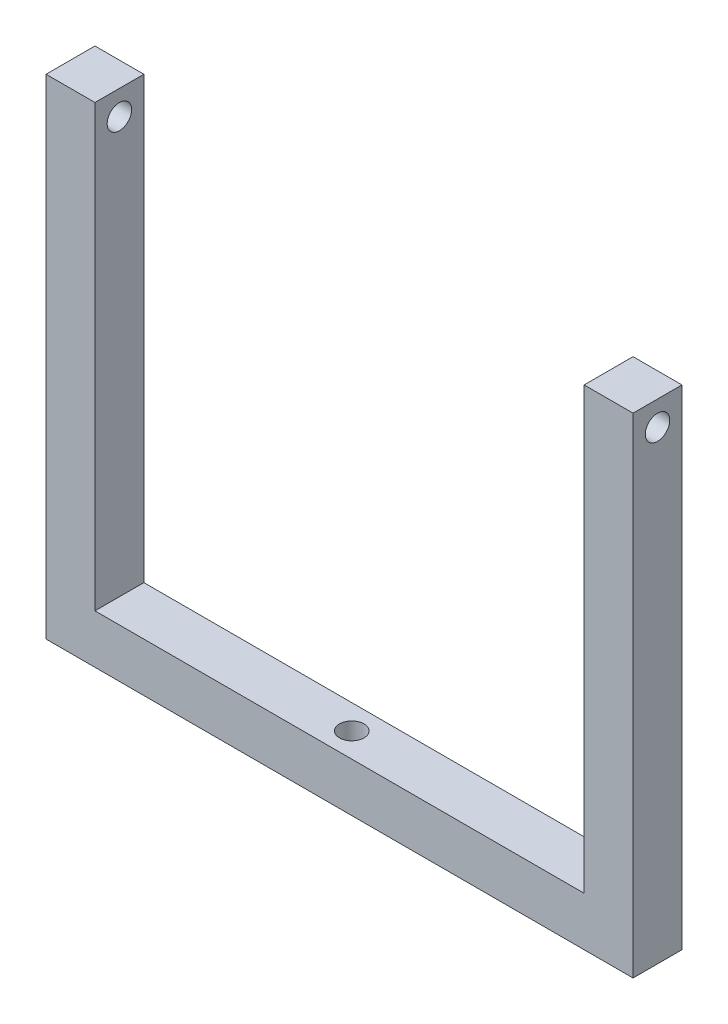
ISO-10303-21;
HEADER;
FILE_DESCRIPTION(('STEP AP214'),'2;1');
FILE_NAME('part.step','',(''),(''),'','','');
FILE_SCHEMA(('AUTOMOTIVE_DESIGN { 1 0 10303 214 1 1 1 1 }'));
ENDSEC;
DATA;
#1=APPLICATION_CONTEXT('core data for automotive mechanical design processes');
#2=APPLICATION_PROTOCOL_DEFINITION('international standard','automotive_design',2000,#1);
#3=PRODUCT_CONTEXT('',#1,'mechanical');
#4=PRODUCT('Part','Part','',(#3));
#5=PRODUCT_RELATED_PRODUCT_CATEGORY('part','',(#4));
#6=PRODUCT_DEFINITION_FORMATION('','',#4);
#7=PRODUCT_DEFINITION_CONTEXT('part definition',#1,'design');
#8=PRODUCT_DEFINITION('design','',#6,#7);
#9=PRODUCT_DEFINITION_SHAPE('','',#8);
#10=(LENGTH_UNIT() NAMED_UNIT(*) SI_UNIT(.MILLI.,.METRE.));
#11=(NAMED_UNIT(*) PLANE_ANGLE_UNIT() SI_UNIT($,.RADIAN.));
#12=(NAMED_UNIT(*) SI_UNIT($,.STERADIAN.) SOLID_ANGLE_UNIT());
#13=UNCERTAINTY_MEASURE_WITH_UNIT(LENGTH_MEASURE(1.E-05),#10,'distance_accuracy_value','');
#14=(GEOMETRIC_REPRESENTATION_CONTEXT(3) GLOBAL_UNCERTAINTY_ASSIGNED_CONTEXT((#13)) GLOBAL_UNIT_ASSIGNED_CONTEXT((#10,
#11,#12)) REPRESENTATION_CONTEXT('',''));
#15=CARTESIAN_POINT('',(0.,0.,0.));
#16=DIRECTION('',(0.,0.,1.));
#17=DIRECTION('',(1.,0.,0.));
#18=AXIS2_PLACEMENT_3D('',#15,#16,#17);
#19=CARTESIAN_POINT('',(0.,0.,12.7));
#20=DIRECTION('',(0.,-1.,0.));
#21=DIRECTION('',(1.,0.,0.));
#22=AXIS2_PLACEMENT_3D('',#19,#20,#21);
#23=PLANE('',#22);
#24=DIRECTION('',(-1.,0.,0.));
#25=VECTOR('',#24,1.);
#26=CARTESIAN_POINT('',(0.,0.,0.));
#27=LINE('',#26,#25);
#28=CARTESIAN_POINT('',(0.,0.,0.));
#29=VERTEX_POINT('',#28);
#30=CARTESIAN_POINT('',(-12.7,0.,0.));
#31=VERTEX_POINT('',#30);
#32=EDGE_CURVE('E141',#29,#31,#27,.T.);
#33=ORIENTED_EDGE('',*,*,#32,.T.);
#34=DIRECTION('',(0.,0.,-1.));
#35=VECTOR('',#34,1.);
#36=CARTESIAN_POINT('',(-12.7,0.,12.7));
#37=LINE('',#36,#35);
#38=CARTESIAN_POINT('',(-12.7,0.,12.7));
#39=VERTEX_POINT('',#38);
#40=EDGE_CURVE('E11',#39,#31,#37,.T.);
#41=ORIENTED_EDGE('',*,*,#40,.F.);
#42=DIRECTION('',(-1.,0.,0.));
#43=VECTOR('',#42,1.);
#44=CARTESIAN_POINT('',(0.,0.,12.7));
#45=LINE('',#44,#43);
#46=CARTESIAN_POINT('',(0.,0.,12.7));
#47=VERTEX_POINT('',#46);
#48=EDGE_CURVE('E164',#47,#39,#45,.T.);
#49=ORIENTED_EDGE('',*,*,#48,.F.);
#50=DIRECTION('',(0.,0.,-1.));
#51=VECTOR('',#50,1.);
#52=CARTESIAN_POINT('',(0.,0.,12.7));
#53=LINE('',#52,#51);
#54=EDGE_CURVE('E137',#47,#29,#53,.T.);
#55=ORIENTED_EDGE('',*,*,#54,.T.);
#56=EDGE_LOOP('',(#33,#41,#49,#55));
#57=FACE_BOUND('',#56,.T.);
#58=ADVANCED_FACE('F39',(#57),#23,.F.);
#59=CARTESIAN_POINT('',(-12.7,0.,12.7));
#60=DIRECTION('',(1.,0.,0.));
#61=DIRECTION('',(0.,1.,0.));
#62=AXIS2_PLACEMENT_3D('',#59,#60,#61);
#63=PLANE('',#62);
#64=CARTESIAN_POINT('',(-12.7,-6.35,6.35));
#65=DIRECTION('',(-1.,0.,0.));
#66=DIRECTION('',(0.,-1.,0.));
#67=AXIS2_PLACEMENT_3D('',#64,#65,#66);
#68=CIRCLE('',#67,3.175);
#69=CARTESIAN_POINT('',(-12.7,-9.525,6.35));
#70=VERTEX_POINT('',#69);
#71=EDGE_CURVE('E216',#70,#70,#68,.T.);
#72=ORIENTED_EDGE('',*,*,#71,.F.);
#73=EDGE_LOOP('',(#72));
#74=FACE_BOUND('',#73,.T.);
#75=DIRECTION('',(0.,-1.,0.));
#76=VECTOR('',#75,1.);
#77=CARTESIAN_POINT('',(-12.7,0.,0.));
#78=LINE('',#77,#76);
#79=CARTESIAN_POINT('',(-12.7,-127.,0.));
#80=VERTEX_POINT('',#79);
#81=EDGE_CURVE('E145',#31,#80,#78,.T.);
#82=ORIENTED_EDGE('',*,*,#81,.T.);
#83=DIRECTION('',(0.,0.,-1.));
#84=VECTOR('',#83,1.);
#85=CARTESIAN_POINT('',(-12.7,-127.,12.7));
#86=LINE('',#85,#84);
#87=CARTESIAN_POINT('',(-12.7,-127.,12.7));
#88=VERTEX_POINT('',#87);
#89=EDGE_CURVE('E49',#88,#80,#86,.T.);
#90=ORIENTED_EDGE('',*,*,#89,.F.);
#91=DIRECTION('',(0.,-1.,0.));
#92=VECTOR('',#91,1.);
#93=CARTESIAN_POINT('',(-12.7,0.,12.7));
#94=LINE('',#93,#92);
#95=EDGE_CURVE('E100',#39,#88,#94,.T.);
#96=ORIENTED_EDGE('',*,*,#95,.F.);
#97=ORIENTED_EDGE('',*,*,#40,.T.);
#98=EDGE_LOOP('',(#82,#90,#96,#97));
#99=FACE_BOUND('',#98,.T.);
#100=ADVANCED_FACE('F243',(#74,#99),#63,.F.);
#101=CARTESIAN_POINT('',(-12.7,-127.,12.7));
#102=DIRECTION('',(0.,1.,0.));
#103=DIRECTION('',(0.,0.,1.));
#104=AXIS2_PLACEMENT_3D('',#101,#102,#103);
#105=PLANE('',#104);
#106=CARTESIAN_POINT('',(60.325,-127.,6.35));
#107=DIRECTION('',(0.,1.,0.));
#108=DIRECTION('',(0.,0.,1.));
#109=AXIS2_PLACEMENT_3D('',#106,#107,#108);
#110=CIRCLE('',#109,3.17500000000001);
#111=CARTESIAN_POINT('',(60.325,-127.,9.52500000000001));
#112=VERTEX_POINT('',#111);
#113=EDGE_CURVE('E220',#112,#112,#110,.F.);
#114=ORIENTED_EDGE('',*,*,#113,.F.);
#115=EDGE_LOOP('',(#114));
#116=FACE_BOUND('',#115,.T.);
#117=DIRECTION('',(1.,0.,0.));
#118=VECTOR('',#117,1.);
#119=CARTESIAN_POINT('',(-12.7,-127.,0.));
#120=LINE('',#119,#118);
#121=CARTESIAN_POINT('',(139.7,-127.,0.));
#122=VERTEX_POINT('',#121);
#123=EDGE_CURVE('E149',#80,#122,#120,.T.);
#124=ORIENTED_EDGE('',*,*,#123,.T.);
#125=DIRECTION('',(0.,0.,-1.));
#126=VECTOR('',#125,1.);
#127=CARTESIAN_POINT('',(139.7,-127.,12.7));
#128=LINE('',#127,#126);
#129=CARTESIAN_POINT('',(139.7,-127.,12.7));
#130=VERTEX_POINT('',#129);
#131=EDGE_CURVE('E175',#130,#122,#128,.T.);
#132=ORIENTED_EDGE('',*,*,#131,.F.);
#133=DIRECTION('',(1.,0.,0.));
#134=VECTOR('',#133,1.);
#135=CARTESIAN_POINT('',(-12.7,-127.,12.7));
#136=LINE('',#135,#134);
#137=EDGE_CURVE('E186',#88,#130,#136,.T.);
#138=ORIENTED_EDGE('',*,*,#137,.F.);
#139=ORIENTED_EDGE('',*,*,#89,.T.);
#140=EDGE_LOOP('',(#124,#132,#138,#139));
#141=FACE_BOUND('',#140,.T.);
#142=ADVANCED_FACE('F184',(#116,#141),#105,.F.);
#143=CARTESIAN_POINT('',(139.7,-127.,12.7));
#144=DIRECTION('',(-1.,0.,0.));
#145=DIRECTION('',(0.,0.,1.));
#146=AXIS2_PLACEMENT_3D('',#143,#144,#145);
#147=PLANE('',#146);
#148=CARTESIAN_POINT('',(139.7,-6.34999999999998,6.35));
#149=DIRECTION('',(-1.,0.,0.));
#150=DIRECTION('',(0.,0.,1.));
#151=AXIS2_PLACEMENT_3D('',#148,#149,#150);
#152=CIRCLE('',#151,3.175);
#153=CARTESIAN_POINT('',(139.7,-6.34999999999998,9.525));
#154=VERTEX_POINT('',#153);
#155=EDGE_CURVE('E212',#154,#154,#152,.F.);
#156=ORIENTED_EDGE('',*,*,#155,.F.);
#157=EDGE_LOOP('',(#156));
#158=FACE_BOUND('',#157,.T.);
#159=DIRECTION('',(0.,1.,0.));
#160=VECTOR('',#159,1.);
#161=CARTESIAN_POINT('',(139.7,-127.,0.));
#162=LINE('',#161,#160);
#163=CARTESIAN_POINT('',(139.7,0.,0.));
#164=VERTEX_POINT('',#163);
#165=EDGE_CURVE('E152',#122,#164,#162,.T.);
#166=ORIENTED_EDGE('',*,*,#165,.T.);
#167=DIRECTION('',(0.,0.,-1.));
#168=VECTOR('',#167,1.);
#169=CARTESIAN_POINT('',(139.7,0.,12.7));
#170=LINE('',#169,#168);
#171=CARTESIAN_POINT('',(139.7,0.,12.7));
#172=VERTEX_POINT('',#171);
#173=EDGE_CURVE('E171',#172,#164,#170,.T.);
#174=ORIENTED_EDGE('',*,*,#173,.F.);
#175=DIRECTION('',(0.,1.,0.));
#176=VECTOR('',#175,1.);
#177=CARTESIAN_POINT('',(139.7,-127.,12.7));
#178=LINE('',#177,#176);
#179=EDGE_CURVE('E199',#130,#172,#178,.T.);
#180=ORIENTED_EDGE('',*,*,#179,.F.);
#181=ORIENTED_EDGE('',*,*,#131,.T.);
#182=EDGE_LOOP('',(#166,#174,#180,#181));
#183=FACE_BOUND('',#182,.T.);
#184=ADVANCED_FACE('F194',(#158,#183),#147,.F.);
#185=CARTESIAN_POINT('',(139.7,0.,12.7));
#186=DIRECTION('',(0.,-1.,0.));
#187=DIRECTION('',(1.,0.,0.));
#188=AXIS2_PLACEMENT_3D('',#185,#186,#187);
#189=PLANE('',#188);
#190=DIRECTION('',(-1.,0.,0.));
#191=VECTOR('',#190,1.);
#192=CARTESIAN_POINT('',(139.7,0.,0.));
#193=LINE('',#192,#191);
#194=CARTESIAN_POINT('',(127.,0.,0.));
#195=VERTEX_POINT('',#194);
#196=EDGE_CURVE('E155',#164,#195,#193,.T.);
#197=ORIENTED_EDGE('',*,*,#196,.T.);
#198=DIRECTION('',(0.,0.,-1.));
#199=VECTOR('',#198,1.);
#200=CARTESIAN_POINT('',(127.,0.,12.7));
#201=LINE('',#200,#199);
#202=CARTESIAN_POINT('',(127.,0.,12.7));
#203=VERTEX_POINT('',#202);
#204=EDGE_CURVE('E130',#203,#195,#201,.T.);
#205=ORIENTED_EDGE('',*,*,#204,.F.);
#206=DIRECTION('',(-1.,0.,0.));
#207=VECTOR('',#206,1.);
#208=CARTESIAN_POINT('',(139.7,0.,12.7));
#209=LINE('',#208,#207);
#210=EDGE_CURVE('E119',#172,#203,#209,.T.);
#211=ORIENTED_EDGE('',*,*,#210,.F.);
#212=ORIENTED_EDGE('',*,*,#173,.T.);
#213=EDGE_LOOP('',(#197,#205,#211,#212));
#214=FACE_BOUND('',#213,.T.);
#215=ADVANCED_FACE('F197',(#214),#189,.F.);
#216=CARTESIAN_POINT('',(127.,0.,12.7));
#217=DIRECTION('',(1.,0.,0.));
#218=DIRECTION('',(0.,1.,0.));
#219=AXIS2_PLACEMENT_3D('',#216,#217,#218);
#220=PLANE('',#219);
#221=CARTESIAN_POINT('',(127.,-6.34999999999998,6.35));
#222=DIRECTION('',(1.,0.,0.));
#223=DIRECTION('',(0.,1.,0.));
#224=AXIS2_PLACEMENT_3D('',#221,#222,#223);
#225=CIRCLE('',#224,3.175);
#226=CARTESIAN_POINT('',(127.,-3.17499999999998,6.35));
#227=VERTEX_POINT('',#226);
#228=EDGE_CURVE('E146',#227,#227,#225,.T.);
#229=ORIENTED_EDGE('',*,*,#228,.T.);
#230=EDGE_LOOP('',(#229));
#231=FACE_BOUND('',#230,.T.);
#232=DIRECTION('',(0.,-1.,0.));
#233=VECTOR('',#232,1.);
#234=CARTESIAN_POINT('',(127.,0.,0.));
#235=LINE('',#234,#233);
#236=CARTESIAN_POINT('',(127.,-114.3,0.));
#237=VERTEX_POINT('',#236);
#238=EDGE_CURVE('E128',#195,#237,#235,.T.);
#239=ORIENTED_EDGE('',*,*,#238,.T.);
#240=DIRECTION('',(0.,0.,-1.));
#241=VECTOR('',#240,1.);
#242=CARTESIAN_POINT('',(127.,-114.3,12.7));
#243=LINE('',#242,#241);
#244=CARTESIAN_POINT('',(127.,-114.3,12.7));
#245=VERTEX_POINT('',#244);
#246=EDGE_CURVE('E125',#245,#237,#243,.T.);
#247=ORIENTED_EDGE('',*,*,#246,.F.);
#248=DIRECTION('',(0.,-1.,0.));
#249=VECTOR('',#248,1.);
#250=CARTESIAN_POINT('',(127.,0.,12.7));
#251=LINE('',#250,#249);
#252=EDGE_CURVE('E113',#203,#245,#251,.T.);
#253=ORIENTED_EDGE('',*,*,#252,.F.);
#254=ORIENTED_EDGE('',*,*,#204,.T.);
#255=EDGE_LOOP('',(#239,#247,#253,#254));
#256=FACE_BOUND('',#255,.T.);
#257=ADVANCED_FACE('F126',(#231,#256),#220,.F.);
#258=CARTESIAN_POINT('',(127.,-114.3,12.7));
#259=DIRECTION('',(0.,-1.,0.));
#260=DIRECTION('',(1.,0.,0.));
#261=AXIS2_PLACEMENT_3D('',#258,#259,#260);
#262=PLANE('',#261);
#263=CARTESIAN_POINT('',(60.325,-114.3,6.35));
#264=DIRECTION('',(0.,1.,0.));
#265=DIRECTION('',(-1.,0.,0.));
#266=AXIS2_PLACEMENT_3D('',#263,#264,#265);
#267=CIRCLE('',#266,3.17500000000001);
#268=CARTESIAN_POINT('',(57.15,-114.3,6.35));
#269=VERTEX_POINT('',#268);
#270=EDGE_CURVE('E224',#269,#269,#267,.T.);
#271=ORIENTED_EDGE('',*,*,#270,.F.);
#272=EDGE_LOOP('',(#271));
#273=FACE_BOUND('',#272,.T.);
#274=DIRECTION('',(-1.,0.,0.));
#275=VECTOR('',#274,1.);
#276=CARTESIAN_POINT('',(127.,-114.3,0.));
#277=LINE('',#276,#275);
#278=CARTESIAN_POINT('',(0.,-114.3,0.));
#279=VERTEX_POINT('',#278);
#280=EDGE_CURVE('E86',#237,#279,#277,.T.);
#281=ORIENTED_EDGE('',*,*,#280,.T.);
#282=DIRECTION('',(0.,0.,-1.));
#283=VECTOR('',#282,1.);
#284=CARTESIAN_POINT('',(0.,-114.3,12.7));
#285=LINE('',#284,#283);
#286=CARTESIAN_POINT('',(0.,-114.3,12.7));
#287=VERTEX_POINT('',#286);
#288=EDGE_CURVE('E131',#287,#279,#285,.T.);
#289=ORIENTED_EDGE('',*,*,#288,.F.);
#290=DIRECTION('',(-1.,0.,0.));
#291=VECTOR('',#290,1.);
#292=CARTESIAN_POINT('',(127.,-114.3,12.7));
#293=LINE('',#292,#291);
#294=EDGE_CURVE('E117',#245,#287,#293,.T.);
#295=ORIENTED_EDGE('',*,*,#294,.F.);
#296=ORIENTED_EDGE('',*,*,#246,.T.);
#297=EDGE_LOOP('',(#281,#289,#295,#296));
#298=FACE_BOUND('',#297,.T.);
#299=ADVANCED_FACE('F133',(#273,#298),#262,.F.);
#300=CARTESIAN_POINT('',(0.,-114.3,12.7));
#301=DIRECTION('',(-1.,0.,0.));
#302=DIRECTION('',(0.,0.,1.));
#303=AXIS2_PLACEMENT_3D('',#300,#301,#302);
#304=PLANE('',#303);
#305=CARTESIAN_POINT('',(0.,-6.35,6.35));
#306=DIRECTION('',(-1.,0.,0.));
#307=DIRECTION('',(0.,0.,1.));
#308=AXIS2_PLACEMENT_3D('',#305,#306,#307);
#309=CIRCLE('',#308,3.175);
#310=CARTESIAN_POINT('',(0.,-6.35,9.525));
#311=VERTEX_POINT('',#310);
#312=EDGE_CURVE('E42',#311,#311,#309,.T.);
#313=ORIENTED_EDGE('',*,*,#312,.T.);
#314=EDGE_LOOP('',(#313));
#315=FACE_BOUND('',#314,.T.);
#316=DIRECTION('',(0.,1.,0.));
#317=VECTOR('',#316,1.);
#318=CARTESIAN_POINT('',(0.,-114.3,0.));
#319=LINE('',#318,#317);
#320=EDGE_CURVE('E92',#279,#29,#319,.T.);
#321=ORIENTED_EDGE('',*,*,#320,.T.);
#322=ORIENTED_EDGE('',*,*,#54,.F.);
#323=DIRECTION('',(0.,1.,0.));
#324=VECTOR('',#323,1.);
#325=CARTESIAN_POINT('',(0.,-114.3,12.7));
#326=LINE('',#325,#324);
#327=EDGE_CURVE('E57',#287,#47,#326,.T.);
#328=ORIENTED_EDGE('',*,*,#327,.F.);
#329=ORIENTED_EDGE('',*,*,#288,.T.);
#330=EDGE_LOOP('',(#321,#322,#328,#329));
#331=FACE_BOUND('',#330,.T.);
#332=ADVANCED_FACE('F232',(#315,#331),#304,.F.);
#333=CARTESIAN_POINT('',(0.,0.,12.7));
#334=DIRECTION('',(0.,0.,1.));
#335=DIRECTION('',(1.,0.,0.));
#336=AXIS2_PLACEMENT_3D('',#333,#334,#335);
#337=PLANE('',#336);
#338=ORIENTED_EDGE('',*,*,#48,.T.);
#339=ORIENTED_EDGE('',*,*,#95,.T.);
#340=ORIENTED_EDGE('',*,*,#137,.T.);
#341=ORIENTED_EDGE('',*,*,#179,.T.);
#342=ORIENTED_EDGE('',*,*,#210,.T.);
#343=ORIENTED_EDGE('',*,*,#252,.T.);
#344=ORIENTED_EDGE('',*,*,#294,.T.);
#345=ORIENTED_EDGE('',*,*,#327,.T.);
#346=EDGE_LOOP('',(#338,#339,#340,#341,#342,#343,#344,#345));
#347=FACE_BOUND('',#346,.T.);
#348=ADVANCED_FACE('F115',(#347),#337,.T.);
#349=CARTESIAN_POINT('',(0.,0.,0.));
#350=DIRECTION('',(0.,0.,1.));
#351=DIRECTION('',(1.,0.,0.));
#352=AXIS2_PLACEMENT_3D('',#349,#350,#351);
#353=PLANE('',#352);
#354=ORIENTED_EDGE('',*,*,#32,.F.);
#355=ORIENTED_EDGE('',*,*,#320,.F.);
#356=ORIENTED_EDGE('',*,*,#280,.F.);
#357=ORIENTED_EDGE('',*,*,#238,.F.);
#358=ORIENTED_EDGE('',*,*,#196,.F.);
#359=ORIENTED_EDGE('',*,*,#165,.F.);
#360=ORIENTED_EDGE('',*,*,#123,.F.);
#361=ORIENTED_EDGE('',*,*,#81,.F.);
#362=EDGE_LOOP('',(#354,#355,#356,#357,#358,#359,#360,#361));
#363=FACE_BOUND('',#362,.T.);
#364=ADVANCED_FACE('F190',(#363),#353,.F.);
#365=CARTESIAN_POINT('',(148.680256121069,-6.34999999999998,6.35));
#366=DIRECTION('',(-1.,0.,0.));
#367=DIRECTION('',(0.,-1.,0.));
#368=AXIS2_PLACEMENT_3D('',#365,#366,#367);
#369=CYLINDRICAL_SURFACE('',#368,3.175);
#370=ORIENTED_EDGE('',*,*,#71,.T.);
#371=EDGE_LOOP('',(#370));
#372=FACE_BOUND('',#371,.T.);
#373=ORIENTED_EDGE('',*,*,#312,.F.);
#374=EDGE_LOOP('',(#373));
#375=FACE_BOUND('',#374,.T.);
#376=ADVANCED_FACE('F287',(#372,#375),#369,.F.);
#377=ORIENTED_EDGE('',*,*,#155,.T.);
#378=EDGE_LOOP('',(#377));
#379=FACE_BOUND('',#378,.T.);
#380=ORIENTED_EDGE('',*,*,#228,.F.);
#381=EDGE_LOOP('',(#380));
#382=FACE_BOUND('',#381,.T.);
#383=ADVANCED_FACE('F292',(#379,#382),#369,.F.);
#384=CARTESIAN_POINT('',(60.325,-135.980256121069,6.35));
#385=DIRECTION('',(0.,1.,0.));
#386=DIRECTION('',(-1.,0.,0.));
#387=AXIS2_PLACEMENT_3D('',#384,#385,#386);
#388=CYLINDRICAL_SURFACE('',#387,3.17500000000001);
#389=ORIENTED_EDGE('',*,*,#113,.T.);
#390=EDGE_LOOP('',(#389));
#391=FACE_BOUND('',#390,.T.);
#392=ORIENTED_EDGE('',*,*,#270,.T.);
#393=EDGE_LOOP('',(#392));
#394=FACE_BOUND('',#393,.T.);
#395=ADVANCED_FACE('F229',(#391,#394),#388,.F.);
#396=CLOSED_SHELL('',(#58,#100,#142,#184,#215,#257,#299,#332,#348,#364,#376,#383,#395));
#397=MANIFOLD_SOLID_BREP('B2',#396);
#398=ADVANCED_BREP_SHAPE_REPRESENTATION('',(#18,#397),#14);
#399=SHAPE_DEFINITION_REPRESENTATION(#9,#398);
ENDSEC;
END-ISO-10303-21;
